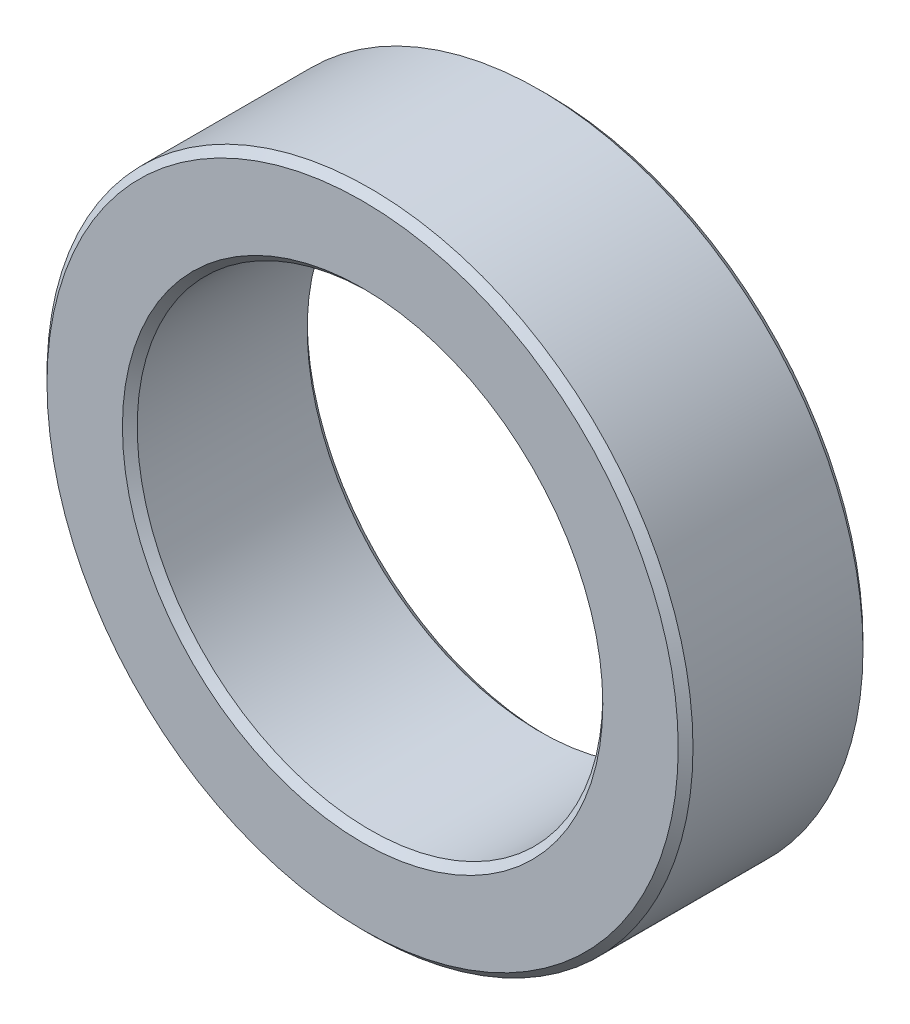
ISO-10303-21;
HEADER;
FILE_DESCRIPTION(('STEP AP214'),'2;1');
FILE_NAME('part.step','',(''),(''),'','','');
FILE_SCHEMA(('AUTOMOTIVE_DESIGN { 1 0 10303 214 1 1 1 1 }'));
ENDSEC;
DATA;
#1=APPLICATION_CONTEXT('core data for automotive mechanical design processes');
#2=APPLICATION_PROTOCOL_DEFINITION('international standard','automotive_design',2000,#1);
#3=PRODUCT_CONTEXT('',#1,'mechanical');
#4=PRODUCT('Part','Part','',(#3));
#5=PRODUCT_RELATED_PRODUCT_CATEGORY('part','',(#4));
#6=PRODUCT_DEFINITION_FORMATION('','',#4);
#7=PRODUCT_DEFINITION_CONTEXT('part definition',#1,'design');
#8=PRODUCT_DEFINITION('design','',#6,#7);
#9=PRODUCT_DEFINITION_SHAPE('','',#8);
#10=(LENGTH_UNIT() NAMED_UNIT(*) SI_UNIT(.MILLI.,.METRE.));
#11=(NAMED_UNIT(*) PLANE_ANGLE_UNIT() SI_UNIT($,.RADIAN.));
#12=(NAMED_UNIT(*) SI_UNIT($,.STERADIAN.) SOLID_ANGLE_UNIT());
#13=UNCERTAINTY_MEASURE_WITH_UNIT(LENGTH_MEASURE(1.E-05),#10,'distance_accuracy_value','');
#14=(GEOMETRIC_REPRESENTATION_CONTEXT(3) GLOBAL_UNCERTAINTY_ASSIGNED_CONTEXT((#13)) GLOBAL_UNIT_ASSIGNED_CONTEXT((#10,
#11,#12)) REPRESENTATION_CONTEXT('',''));
#15=CARTESIAN_POINT('',(0.,0.,0.));
#16=DIRECTION('',(0.,0.,1.));
#17=DIRECTION('',(1.,0.,0.));
#18=AXIS2_PLACEMENT_3D('',#15,#16,#17);
#19=CARTESIAN_POINT('',(0.,0.,3.175));
#20=DIRECTION('',(0.,0.,1.));
#21=DIRECTION('',(1.,0.,0.));
#22=AXIS2_PLACEMENT_3D('',#19,#20,#21);
#23=PLANE('',#22);
#24=CARTESIAN_POINT('',(0.,0.,3.175));
#25=DIRECTION('',(0.,0.,1.));
#26=DIRECTION('',(1.,0.,0.));
#27=AXIS2_PLACEMENT_3D('',#24,#25,#26);
#28=CIRCLE('',#27,4.127000001);
#29=CARTESIAN_POINT('',(4.127000001,0.,3.175));
#30=VERTEX_POINT('',#29);
#31=EDGE_CURVE('E59',#30,#30,#28,.F.);
#32=ORIENTED_EDGE('',*,*,#31,.T.);
#33=EDGE_LOOP('',(#32));
#34=FACE_BOUND('',#33,.T.);
#35=CARTESIAN_POINT('',(0.,0.,3.175));
#36=DIRECTION('',(0.,0.,1.));
#37=DIRECTION('',(1.,0.,0.));
#38=AXIS2_PLACEMENT_3D('',#35,#36,#37);
#39=CIRCLE('',#38,5.42289999999999);
#40=CARTESIAN_POINT('',(5.42289999999999,0.,3.175));
#41=VERTEX_POINT('',#40);
#42=EDGE_CURVE('E64',#41,#41,#39,.T.);
#43=ORIENTED_EDGE('',*,*,#42,.T.);
#44=EDGE_LOOP('',(#43));
#45=FACE_BOUND('',#44,.T.);
#46=ADVANCED_FACE('F45',(#34,#45),#23,.T.);
#47=CARTESIAN_POINT('',(0.,0.,0.));
#48=DIRECTION('',(0.,0.,1.));
#49=DIRECTION('',(1.,0.,0.));
#50=AXIS2_PLACEMENT_3D('',#47,#48,#49);
#51=PLANE('',#50);
#52=CARTESIAN_POINT('',(0.,0.,0.));
#53=DIRECTION('',(0.,0.,1.));
#54=DIRECTION('',(1.,0.,0.));
#55=AXIS2_PLACEMENT_3D('',#52,#53,#54);
#56=CIRCLE('',#55,4.127000001);
#57=CARTESIAN_POINT('',(4.127000001,0.,0.));
#58=VERTEX_POINT('',#57);
#59=EDGE_CURVE('E78',#58,#58,#56,.T.);
#60=ORIENTED_EDGE('',*,*,#59,.T.);
#61=EDGE_LOOP('',(#60));
#62=FACE_BOUND('',#61,.T.);
#63=CARTESIAN_POINT('',(0.,0.,0.));
#64=DIRECTION('',(0.,0.,1.));
#65=DIRECTION('',(1.,0.,0.));
#66=AXIS2_PLACEMENT_3D('',#63,#64,#65);
#67=CIRCLE('',#66,5.42289999999999);
#68=CARTESIAN_POINT('',(5.42289999999999,0.,0.));
#69=VERTEX_POINT('',#68);
#70=EDGE_CURVE('E82',#69,#69,#67,.F.);
#71=ORIENTED_EDGE('',*,*,#70,.T.);
#72=EDGE_LOOP('',(#71));
#73=FACE_BOUND('',#72,.T.);
#74=ADVANCED_FACE('F87',(#62,#73),#51,.F.);
#75=CARTESIAN_POINT('',(0.,0.,3.175));
#76=DIRECTION('',(0.,0.,-1.));
#77=DIRECTION('',(-1.,0.,0.));
#78=AXIS2_PLACEMENT_3D('',#75,#76,#77);
#79=CYLINDRICAL_SURFACE('',#78,5.5499);
#80=CARTESIAN_POINT('',(0.,0.,0.127));
#81=DIRECTION('',(0.,0.,1.));
#82=DIRECTION('',(1.,0.,0.));
#83=AXIS2_PLACEMENT_3D('',#80,#81,#82);
#84=CIRCLE('',#83,5.5499);
#85=CARTESIAN_POINT('',(5.5499,0.,0.127));
#86=VERTEX_POINT('',#85);
#87=EDGE_CURVE('E10',#86,#86,#84,.T.);
#88=ORIENTED_EDGE('',*,*,#87,.T.);
#89=EDGE_LOOP('',(#88));
#90=FACE_BOUND('',#89,.T.);
#91=CARTESIAN_POINT('',(0.,0.,3.048));
#92=DIRECTION('',(0.,0.,1.));
#93=DIRECTION('',(1.,0.,0.));
#94=AXIS2_PLACEMENT_3D('',#91,#92,#93);
#95=CIRCLE('',#94,5.5499);
#96=CARTESIAN_POINT('',(5.5499,0.,3.048));
#97=VERTEX_POINT('',#96);
#98=EDGE_CURVE('E54',#97,#97,#95,.F.);
#99=ORIENTED_EDGE('',*,*,#98,.T.);
#100=EDGE_LOOP('',(#99));
#101=FACE_BOUND('',#100,.T.);
#102=ADVANCED_FACE('F108',(#90,#101),#79,.T.);
#103=CARTESIAN_POINT('',(0.,0.,3.175));
#104=DIRECTION('',(0.,0.,-1.));
#105=DIRECTION('',(-1.,0.,0.));
#106=AXIS2_PLACEMENT_3D('',#103,#104,#105);
#107=CYLINDRICAL_SURFACE('',#106,4.000000001);
#108=CARTESIAN_POINT('',(0.,0.,0.127000000000003));
#109=DIRECTION('',(0.,0.,1.));
#110=DIRECTION('',(1.,0.,0.));
#111=AXIS2_PLACEMENT_3D('',#108,#109,#110);
#112=CIRCLE('',#111,4.000000001);
#113=CARTESIAN_POINT('',(4.000000001,0.,0.127000000000003));
#114=VERTEX_POINT('',#113);
#115=EDGE_CURVE('E70',#114,#114,#112,.F.);
#116=ORIENTED_EDGE('',*,*,#115,.T.);
#117=EDGE_LOOP('',(#116));
#118=FACE_BOUND('',#117,.T.);
#119=CARTESIAN_POINT('',(0.,0.,3.048));
#120=DIRECTION('',(0.,0.,1.));
#121=DIRECTION('',(1.,0.,0.));
#122=AXIS2_PLACEMENT_3D('',#119,#120,#121);
#123=CIRCLE('',#122,4.000000001);
#124=CARTESIAN_POINT('',(4.000000001,0.,3.048));
#125=VERTEX_POINT('',#124);
#126=EDGE_CURVE('E74',#125,#125,#123,.T.);
#127=ORIENTED_EDGE('',*,*,#126,.T.);
#128=EDGE_LOOP('',(#127));
#129=FACE_BOUND('',#128,.T.);
#130=ADVANCED_FACE('F113',(#118,#129),#107,.F.);
#131=CARTESIAN_POINT('',(0.,0.,0.));
#132=DIRECTION('',(0.,0.,-1.));
#133=DIRECTION('',(-1.,0.,0.));
#134=AXIS2_PLACEMENT_3D('',#131,#132,#133);
#135=CONICAL_SURFACE('',#134,4.127000001,0.785398163397438);
#136=ORIENTED_EDGE('',*,*,#115,.F.);
#137=EDGE_LOOP('',(#136));
#138=FACE_BOUND('',#137,.T.);
#139=ORIENTED_EDGE('',*,*,#59,.F.);
#140=EDGE_LOOP('',(#139));
#141=FACE_BOUND('',#140,.T.);
#142=ADVANCED_FACE('F98',(#138,#141),#135,.F.);
#143=CARTESIAN_POINT('',(0.,0.,3.048));
#144=DIRECTION('',(0.,0.,1.));
#145=DIRECTION('',(1.,0.,0.));
#146=AXIS2_PLACEMENT_3D('',#143,#144,#145);
#147=CONICAL_SURFACE('',#146,4.000000001,0.785398163397448);
#148=ORIENTED_EDGE('',*,*,#31,.F.);
#149=EDGE_LOOP('',(#148));
#150=FACE_BOUND('',#149,.T.);
#151=ORIENTED_EDGE('',*,*,#126,.F.);
#152=EDGE_LOOP('',(#151));
#153=FACE_BOUND('',#152,.T.);
#154=ADVANCED_FACE('F92',(#150,#153),#147,.F.);
#155=CARTESIAN_POINT('',(0.,0.,0.127));
#156=DIRECTION('',(0.,0.,1.));
#157=DIRECTION('',(1.,0.,0.));
#158=AXIS2_PLACEMENT_3D('',#155,#156,#157);
#159=CONICAL_SURFACE('',#158,5.5499,0.785398163397455);
#160=ORIENTED_EDGE('',*,*,#70,.F.);
#161=EDGE_LOOP('',(#160));
#162=FACE_BOUND('',#161,.T.);
#163=ORIENTED_EDGE('',*,*,#87,.F.);
#164=EDGE_LOOP('',(#163));
#165=FACE_BOUND('',#164,.T.);
#166=ADVANCED_FACE('F89',(#162,#165),#159,.T.);
#167=CARTESIAN_POINT('',(0.,0.,3.175));
#168=DIRECTION('',(0.,0.,-1.));
#169=DIRECTION('',(-1.,0.,0.));
#170=AXIS2_PLACEMENT_3D('',#167,#168,#169);
#171=CONICAL_SURFACE('',#170,5.42289999999999,0.785398163397442);
#172=ORIENTED_EDGE('',*,*,#98,.F.);
#173=EDGE_LOOP('',(#172));
#174=FACE_BOUND('',#173,.T.);
#175=ORIENTED_EDGE('',*,*,#42,.F.);
#176=EDGE_LOOP('',(#175));
#177=FACE_BOUND('',#176,.T.);
#178=ADVANCED_FACE('F48',(#174,#177),#171,.T.);
#179=CLOSED_SHELL('',(#46,#74,#102,#130,#142,#154,#166,#178));
#180=MANIFOLD_SOLID_BREP('B2',#179);
#181=ADVANCED_BREP_SHAPE_REPRESENTATION('',(#18,#180),#14);
#182=SHAPE_DEFINITION_REPRESENTATION(#9,#181);
ENDSEC;
END-ISO-10303-21;
